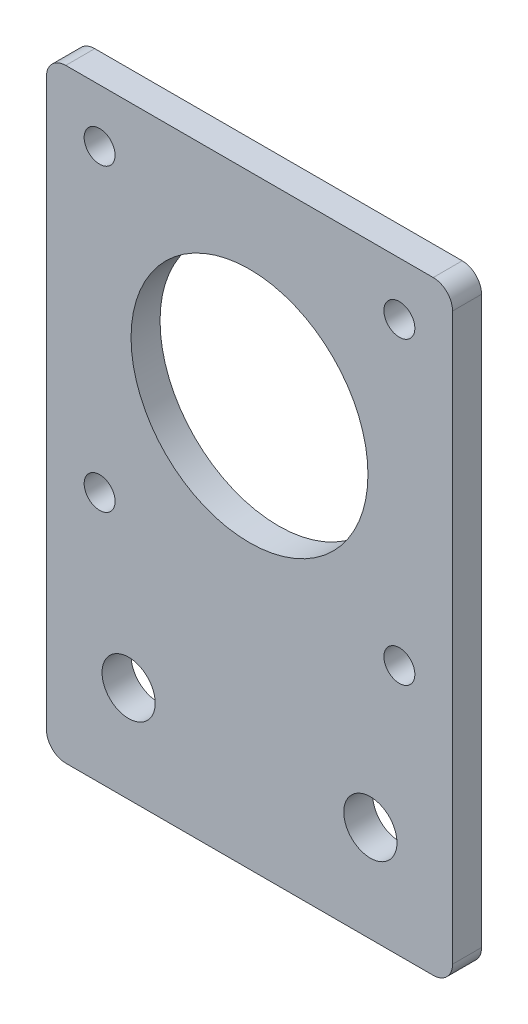
ISO-10303-21;
HEADER;
FILE_DESCRIPTION(('STEP AP214'),'2;1');
FILE_NAME('part.step','',(''),(''),'','','');
FILE_SCHEMA(('AUTOMOTIVE_DESIGN { 1 0 10303 214 1 1 1 1 }'));
ENDSEC;
DATA;
#1=APPLICATION_CONTEXT('core data for automotive mechanical design processes');
#2=APPLICATION_PROTOCOL_DEFINITION('international standard','automotive_design',2000,#1);
#3=PRODUCT_CONTEXT('',#1,'mechanical');
#4=PRODUCT('Part','Part','',(#3));
#5=PRODUCT_RELATED_PRODUCT_CATEGORY('part','',(#4));
#6=PRODUCT_DEFINITION_FORMATION('','',#4);
#7=PRODUCT_DEFINITION_CONTEXT('part definition',#1,'design');
#8=PRODUCT_DEFINITION('design','',#6,#7);
#9=PRODUCT_DEFINITION_SHAPE('','',#8);
#10=(LENGTH_UNIT() NAMED_UNIT(*) SI_UNIT(.MILLI.,.METRE.));
#11=(NAMED_UNIT(*) PLANE_ANGLE_UNIT() SI_UNIT($,.RADIAN.));
#12=(NAMED_UNIT(*) SI_UNIT($,.STERADIAN.) SOLID_ANGLE_UNIT());
#13=UNCERTAINTY_MEASURE_WITH_UNIT(LENGTH_MEASURE(1.E-05),#10,'distance_accuracy_value','');
#14=(GEOMETRIC_REPRESENTATION_CONTEXT(3) GLOBAL_UNCERTAINTY_ASSIGNED_CONTEXT((#13)) GLOBAL_UNIT_ASSIGNED_CONTEXT((#10,
#11,#12)) REPRESENTATION_CONTEXT('',''));
#15=CARTESIAN_POINT('',(0.,0.,0.));
#16=DIRECTION('',(0.,0.,1.));
#17=DIRECTION('',(1.,0.,0.));
#18=AXIS2_PLACEMENT_3D('',#15,#16,#17);
#19=CARTESIAN_POINT('',(0.,0.,1.5));
#20=DIRECTION('',(0.,0.,1.));
#21=DIRECTION('',(1.,0.,0.));
#22=AXIS2_PLACEMENT_3D('',#19,#20,#21);
#23=PLANE('',#22);
#24=CARTESIAN_POINT('',(-12.5,-31.5,1.5));
#25=DIRECTION('',(0.,0.,1.));
#26=DIRECTION('',(1.,0.,0.));
#27=AXIS2_PLACEMENT_3D('',#24,#25,#26);
#28=CIRCLE('',#27,2.75);
#29=CARTESIAN_POINT('',(-9.75,-31.5,1.5));
#30=VERTEX_POINT('',#29);
#31=EDGE_CURVE('E184',#30,#30,#28,.T.);
#32=ORIENTED_EDGE('',*,*,#31,.F.);
#33=EDGE_LOOP('',(#32));
#34=FACE_BOUND('',#33,.T.);
#35=CARTESIAN_POINT('',(-15.5,15.5,1.5));
#36=DIRECTION('',(0.,0.,1.));
#37=DIRECTION('',(1.,0.,0.));
#38=AXIS2_PLACEMENT_3D('',#35,#36,#37);
#39=CIRCLE('',#38,1.6);
#40=CARTESIAN_POINT('',(-13.9,15.5,1.5));
#41=VERTEX_POINT('',#40);
#42=EDGE_CURVE('E196',#41,#41,#39,.T.);
#43=ORIENTED_EDGE('',*,*,#42,.F.);
#44=EDGE_LOOP('',(#43));
#45=FACE_BOUND('',#44,.T.);
#46=CARTESIAN_POINT('',(15.5,-15.5,1.5));
#47=DIRECTION('',(0.,0.,1.));
#48=DIRECTION('',(1.,0.,0.));
#49=AXIS2_PLACEMENT_3D('',#46,#47,#48);
#50=CIRCLE('',#49,1.6);
#51=CARTESIAN_POINT('',(17.1,-15.5,1.5));
#52=VERTEX_POINT('',#51);
#53=EDGE_CURVE('E206',#52,#52,#50,.T.);
#54=ORIENTED_EDGE('',*,*,#53,.F.);
#55=EDGE_LOOP('',(#54));
#56=FACE_BOUND('',#55,.T.);
#57=DIRECTION('',(0.,-1.,0.));
#58=VECTOR('',#57,1.);
#59=CARTESIAN_POINT('',(-21.,21.,1.5));
#60=LINE('',#59,#58);
#61=CARTESIAN_POINT('',(-21.,19.,1.5));
#62=VERTEX_POINT('',#61);
#63=CARTESIAN_POINT('',(-21.,-39.5,1.5));
#64=VERTEX_POINT('',#63);
#65=EDGE_CURVE('E120',#62,#64,#60,.T.);
#66=ORIENTED_EDGE('',*,*,#65,.T.);
#67=CARTESIAN_POINT('',(-19.,-39.5,1.5));
#68=DIRECTION('',(0.,0.,1.));
#69=DIRECTION('',(1.,0.,0.));
#70=AXIS2_PLACEMENT_3D('',#67,#68,#69);
#71=CIRCLE('',#70,2.);
#72=CARTESIAN_POINT('',(-19.,-41.5,1.5));
#73=VERTEX_POINT('',#72);
#74=EDGE_CURVE('E135',#64,#73,#71,.T.);
#75=ORIENTED_EDGE('',*,*,#74,.T.);
#76=DIRECTION('',(1.,0.,0.));
#77=VECTOR('',#76,1.);
#78=CARTESIAN_POINT('',(-21.,-41.5,1.5));
#79=LINE('',#78,#77);
#80=CARTESIAN_POINT('',(19.,-41.5,1.5));
#81=VERTEX_POINT('',#80);
#82=EDGE_CURVE('E102',#73,#81,#79,.T.);
#83=ORIENTED_EDGE('',*,*,#82,.T.);
#84=CARTESIAN_POINT('',(19.,-39.5,1.5));
#85=DIRECTION('',(0.,0.,1.));
#86=DIRECTION('',(1.,0.,0.));
#87=AXIS2_PLACEMENT_3D('',#84,#85,#86);
#88=CIRCLE('',#87,2.);
#89=CARTESIAN_POINT('',(21.,-39.5,1.5));
#90=VERTEX_POINT('',#89);
#91=EDGE_CURVE('E133',#81,#90,#88,.T.);
#92=ORIENTED_EDGE('',*,*,#91,.T.);
#93=DIRECTION('',(0.,1.,0.));
#94=VECTOR('',#93,1.);
#95=CARTESIAN_POINT('',(21.,21.,1.5));
#96=LINE('',#95,#94);
#97=CARTESIAN_POINT('',(21.,19.,1.5));
#98=VERTEX_POINT('',#97);
#99=EDGE_CURVE('E155',#90,#98,#96,.T.);
#100=ORIENTED_EDGE('',*,*,#99,.T.);
#101=CARTESIAN_POINT('',(19.,19.,1.5));
#102=DIRECTION('',(0.,0.,1.));
#103=DIRECTION('',(1.,0.,0.));
#104=AXIS2_PLACEMENT_3D('',#101,#102,#103);
#105=CIRCLE('',#104,2.);
#106=CARTESIAN_POINT('',(19.,21.,1.5));
#107=VERTEX_POINT('',#106);
#108=EDGE_CURVE('E37',#98,#107,#105,.T.);
#109=ORIENTED_EDGE('',*,*,#108,.T.);
#110=DIRECTION('',(-1.,0.,0.));
#111=VECTOR('',#110,1.);
#112=CARTESIAN_POINT('',(-21.,21.,1.5));
#113=LINE('',#112,#111);
#114=CARTESIAN_POINT('',(-19.,21.,1.5));
#115=VERTEX_POINT('',#114);
#116=EDGE_CURVE('E121',#107,#115,#113,.T.);
#117=ORIENTED_EDGE('',*,*,#116,.T.);
#118=CARTESIAN_POINT('',(-19.,19.,1.5));
#119=DIRECTION('',(0.,0.,1.));
#120=DIRECTION('',(1.,0.,0.));
#121=AXIS2_PLACEMENT_3D('',#118,#119,#120);
#122=CIRCLE('',#121,2.);
#123=EDGE_CURVE('E131',#115,#62,#122,.T.);
#124=ORIENTED_EDGE('',*,*,#123,.T.);
#125=EDGE_LOOP('',(#66,#75,#83,#92,#100,#109,#117,#124));
#126=FACE_BOUND('',#125,.T.);
#127=CARTESIAN_POINT('',(0.,0.,1.5));
#128=DIRECTION('',(0.,0.,1.));
#129=DIRECTION('',(1.,0.,0.));
#130=AXIS2_PLACEMENT_3D('',#127,#128,#129);
#131=CIRCLE('',#130,12.25);
#132=CARTESIAN_POINT('',(12.25,0.,1.5));
#133=VERTEX_POINT('',#132);
#134=EDGE_CURVE('E115',#133,#133,#131,.T.);
#135=ORIENTED_EDGE('',*,*,#134,.F.);
#136=EDGE_LOOP('',(#135));
#137=FACE_BOUND('',#136,.T.);
#138=CARTESIAN_POINT('',(-15.5,-15.5,1.5));
#139=DIRECTION('',(0.,0.,1.));
#140=DIRECTION('',(1.,0.,0.));
#141=AXIS2_PLACEMENT_3D('',#138,#139,#140);
#142=CIRCLE('',#141,1.6);
#143=CARTESIAN_POINT('',(-13.9,-15.5,1.5));
#144=VERTEX_POINT('',#143);
#145=EDGE_CURVE('E171',#144,#144,#142,.T.);
#146=ORIENTED_EDGE('',*,*,#145,.F.);
#147=EDGE_LOOP('',(#146));
#148=FACE_BOUND('',#147,.T.);
#149=CARTESIAN_POINT('',(15.5,15.5,1.5));
#150=DIRECTION('',(0.,0.,1.));
#151=DIRECTION('',(1.,0.,0.));
#152=AXIS2_PLACEMENT_3D('',#149,#150,#151);
#153=CIRCLE('',#152,1.6);
#154=CARTESIAN_POINT('',(17.1,15.5,1.5));
#155=VERTEX_POINT('',#154);
#156=EDGE_CURVE('E175',#155,#155,#153,.T.);
#157=ORIENTED_EDGE('',*,*,#156,.F.);
#158=EDGE_LOOP('',(#157));
#159=FACE_BOUND('',#158,.T.);
#160=CARTESIAN_POINT('',(12.5,-31.5,1.5));
#161=DIRECTION('',(0.,0.,1.));
#162=DIRECTION('',(1.,0.,0.));
#163=AXIS2_PLACEMENT_3D('',#160,#161,#162);
#164=CIRCLE('',#163,2.75);
#165=CARTESIAN_POINT('',(15.25,-31.5,1.5));
#166=VERTEX_POINT('',#165);
#167=EDGE_CURVE('E178',#166,#166,#164,.T.);
#168=ORIENTED_EDGE('',*,*,#167,.F.);
#169=EDGE_LOOP('',(#168));
#170=FACE_BOUND('',#169,.T.);
#171=ADVANCED_FACE('F17',(#34,#45,#56,#126,#137,#148,#159,#170),#23,.T.);
#172=CARTESIAN_POINT('',(0.,0.,-1.5));
#173=DIRECTION('',(0.,0.,1.));
#174=DIRECTION('',(1.,0.,0.));
#175=AXIS2_PLACEMENT_3D('',#172,#173,#174);
#176=PLANE('',#175);
#177=DIRECTION('',(1.,0.,0.));
#178=VECTOR('',#177,1.);
#179=CARTESIAN_POINT('',(-21.,-41.5,-1.5));
#180=LINE('',#179,#178);
#181=CARTESIAN_POINT('',(-19.,-41.5,-1.5));
#182=VERTEX_POINT('',#181);
#183=CARTESIAN_POINT('',(19.,-41.5,-1.5));
#184=VERTEX_POINT('',#183);
#185=EDGE_CURVE('E99',#182,#184,#180,.T.);
#186=ORIENTED_EDGE('',*,*,#185,.F.);
#187=CARTESIAN_POINT('',(-19.,-39.5,-1.5));
#188=DIRECTION('',(0.,0.,1.));
#189=DIRECTION('',(1.,0.,0.));
#190=AXIS2_PLACEMENT_3D('',#187,#188,#189);
#191=CIRCLE('',#190,2.);
#192=CARTESIAN_POINT('',(-21.,-39.5,-1.5));
#193=VERTEX_POINT('',#192);
#194=EDGE_CURVE('E82',#182,#193,#191,.F.);
#195=ORIENTED_EDGE('',*,*,#194,.T.);
#196=DIRECTION('',(0.,-1.,0.));
#197=VECTOR('',#196,1.);
#198=CARTESIAN_POINT('',(-21.,21.,-1.5));
#199=LINE('',#198,#197);
#200=CARTESIAN_POINT('',(-21.,19.,-1.5));
#201=VERTEX_POINT('',#200);
#202=EDGE_CURVE('E110',#201,#193,#199,.T.);
#203=ORIENTED_EDGE('',*,*,#202,.F.);
#204=CARTESIAN_POINT('',(-19.,19.,-1.5));
#205=DIRECTION('',(0.,0.,1.));
#206=DIRECTION('',(1.,0.,0.));
#207=AXIS2_PLACEMENT_3D('',#204,#205,#206);
#208=CIRCLE('',#207,2.);
#209=CARTESIAN_POINT('',(-19.,21.,-1.5));
#210=VERTEX_POINT('',#209);
#211=EDGE_CURVE('E124',#201,#210,#208,.F.);
#212=ORIENTED_EDGE('',*,*,#211,.T.);
#213=DIRECTION('',(-1.,0.,0.));
#214=VECTOR('',#213,1.);
#215=CARTESIAN_POINT('',(-21.,21.,-1.5));
#216=LINE('',#215,#214);
#217=CARTESIAN_POINT('',(19.,21.,-1.5));
#218=VERTEX_POINT('',#217);
#219=EDGE_CURVE('E113',#218,#210,#216,.T.);
#220=ORIENTED_EDGE('',*,*,#219,.F.);
#221=CARTESIAN_POINT('',(19.,19.,-1.5));
#222=DIRECTION('',(0.,0.,1.));
#223=DIRECTION('',(1.,0.,0.));
#224=AXIS2_PLACEMENT_3D('',#221,#222,#223);
#225=CIRCLE('',#224,2.);
#226=CARTESIAN_POINT('',(21.,19.,-1.5));
#227=VERTEX_POINT('',#226);
#228=EDGE_CURVE('E103',#218,#227,#225,.F.);
#229=ORIENTED_EDGE('',*,*,#228,.T.);
#230=DIRECTION('',(0.,1.,0.));
#231=VECTOR('',#230,1.);
#232=CARTESIAN_POINT('',(21.,21.,-1.5));
#233=LINE('',#232,#231);
#234=CARTESIAN_POINT('',(21.,-39.5,-1.5));
#235=VERTEX_POINT('',#234);
#236=EDGE_CURVE('E109',#235,#227,#233,.T.);
#237=ORIENTED_EDGE('',*,*,#236,.F.);
#238=CARTESIAN_POINT('',(19.,-39.5,-1.5));
#239=DIRECTION('',(0.,0.,1.));
#240=DIRECTION('',(1.,0.,0.));
#241=AXIS2_PLACEMENT_3D('',#238,#239,#240);
#242=CIRCLE('',#241,2.);
#243=EDGE_CURVE('E93',#235,#184,#242,.F.);
#244=ORIENTED_EDGE('',*,*,#243,.T.);
#245=EDGE_LOOP('',(#186,#195,#203,#212,#220,#229,#237,#244));
#246=FACE_BOUND('',#245,.T.);
#247=CARTESIAN_POINT('',(0.,0.,-1.5));
#248=DIRECTION('',(0.,0.,1.));
#249=DIRECTION('',(1.,0.,0.));
#250=AXIS2_PLACEMENT_3D('',#247,#248,#249);
#251=CIRCLE('',#250,12.25);
#252=CARTESIAN_POINT('',(12.25,0.,-1.5));
#253=VERTEX_POINT('',#252);
#254=EDGE_CURVE('E158',#253,#253,#251,.T.);
#255=ORIENTED_EDGE('',*,*,#254,.T.);
#256=EDGE_LOOP('',(#255));
#257=FACE_BOUND('',#256,.T.);
#258=CARTESIAN_POINT('',(15.5,-15.5,-1.5));
#259=DIRECTION('',(0.,0.,1.));
#260=DIRECTION('',(1.,0.,0.));
#261=AXIS2_PLACEMENT_3D('',#258,#259,#260);
#262=CIRCLE('',#261,1.6);
#263=CARTESIAN_POINT('',(17.1,-15.5,-1.5));
#264=VERTEX_POINT('',#263);
#265=EDGE_CURVE('E203',#264,#264,#262,.T.);
#266=ORIENTED_EDGE('',*,*,#265,.T.);
#267=EDGE_LOOP('',(#266));
#268=FACE_BOUND('',#267,.T.);
#269=CARTESIAN_POINT('',(-15.5,-15.5,-1.5));
#270=DIRECTION('',(0.,0.,1.));
#271=DIRECTION('',(1.,0.,0.));
#272=AXIS2_PLACEMENT_3D('',#269,#270,#271);
#273=CIRCLE('',#272,1.6);
#274=CARTESIAN_POINT('',(-13.9,-15.5,-1.5));
#275=VERTEX_POINT('',#274);
#276=EDGE_CURVE('E199',#275,#275,#273,.T.);
#277=ORIENTED_EDGE('',*,*,#276,.T.);
#278=EDGE_LOOP('',(#277));
#279=FACE_BOUND('',#278,.T.);
#280=CARTESIAN_POINT('',(-15.5,15.5,-1.5));
#281=DIRECTION('',(0.,0.,1.));
#282=DIRECTION('',(1.,0.,0.));
#283=AXIS2_PLACEMENT_3D('',#280,#281,#282);
#284=CIRCLE('',#283,1.6);
#285=CARTESIAN_POINT('',(-13.9,15.5,-1.5));
#286=VERTEX_POINT('',#285);
#287=EDGE_CURVE('E193',#286,#286,#284,.T.);
#288=ORIENTED_EDGE('',*,*,#287,.T.);
#289=EDGE_LOOP('',(#288));
#290=FACE_BOUND('',#289,.T.);
#291=CARTESIAN_POINT('',(15.5,15.5,-1.5));
#292=DIRECTION('',(0.,0.,1.));
#293=DIRECTION('',(1.,0.,0.));
#294=AXIS2_PLACEMENT_3D('',#291,#292,#293);
#295=CIRCLE('',#294,1.6);
#296=CARTESIAN_POINT('',(17.1,15.5,-1.5));
#297=VERTEX_POINT('',#296);
#298=EDGE_CURVE('E190',#297,#297,#295,.T.);
#299=ORIENTED_EDGE('',*,*,#298,.T.);
#300=EDGE_LOOP('',(#299));
#301=FACE_BOUND('',#300,.T.);
#302=CARTESIAN_POINT('',(-12.5,-31.5,-1.5));
#303=DIRECTION('',(0.,0.,1.));
#304=DIRECTION('',(1.,0.,0.));
#305=AXIS2_PLACEMENT_3D('',#302,#303,#304);
#306=CIRCLE('',#305,2.75);
#307=CARTESIAN_POINT('',(-9.75,-31.5,-1.5));
#308=VERTEX_POINT('',#307);
#309=EDGE_CURVE('E180',#308,#308,#306,.T.);
#310=ORIENTED_EDGE('',*,*,#309,.T.);
#311=EDGE_LOOP('',(#310));
#312=FACE_BOUND('',#311,.T.);
#313=CARTESIAN_POINT('',(12.5,-31.5,-1.5));
#314=DIRECTION('',(0.,0.,1.));
#315=DIRECTION('',(1.,0.,0.));
#316=AXIS2_PLACEMENT_3D('',#313,#314,#315);
#317=CIRCLE('',#316,2.75);
#318=CARTESIAN_POINT('',(15.25,-31.5,-1.5));
#319=VERTEX_POINT('',#318);
#320=EDGE_CURVE('E181',#319,#319,#317,.T.);
#321=ORIENTED_EDGE('',*,*,#320,.T.);
#322=EDGE_LOOP('',(#321));
#323=FACE_BOUND('',#322,.T.);
#324=ADVANCED_FACE('F106',(#246,#257,#268,#279,#290,#301,#312,#323),#176,.F.);
#325=CARTESIAN_POINT('',(-21.,21.,1.5));
#326=DIRECTION('',(1.,0.,0.));
#327=DIRECTION('',(0.,1.,0.));
#328=AXIS2_PLACEMENT_3D('',#325,#326,#327);
#329=PLANE('',#328);
#330=ORIENTED_EDGE('',*,*,#202,.T.);
#331=DIRECTION('',(0.,0.,-1.));
#332=VECTOR('',#331,1.);
#333=CARTESIAN_POINT('',(-21.,-39.5,1.5));
#334=LINE('',#333,#332);
#335=EDGE_CURVE('E87',#193,#64,#334,.F.);
#336=ORIENTED_EDGE('',*,*,#335,.T.);
#337=ORIENTED_EDGE('',*,*,#65,.F.);
#338=DIRECTION('',(0.,0.,-1.));
#339=VECTOR('',#338,1.);
#340=CARTESIAN_POINT('',(-21.,19.,1.5));
#341=LINE('',#340,#339);
#342=EDGE_CURVE('E92',#62,#201,#341,.T.);
#343=ORIENTED_EDGE('',*,*,#342,.T.);
#344=EDGE_LOOP('',(#330,#336,#337,#343));
#345=FACE_BOUND('',#344,.T.);
#346=ADVANCED_FACE('F152',(#345),#329,.F.);
#347=CARTESIAN_POINT('',(-21.,-41.5,1.5));
#348=DIRECTION('',(0.,1.,0.));
#349=DIRECTION('',(0.,0.,1.));
#350=AXIS2_PLACEMENT_3D('',#347,#348,#349);
#351=PLANE('',#350);
#352=ORIENTED_EDGE('',*,*,#82,.F.);
#353=DIRECTION('',(0.,0.,-1.));
#354=VECTOR('',#353,1.);
#355=CARTESIAN_POINT('',(-19.,-41.5,1.5));
#356=LINE('',#355,#354);
#357=EDGE_CURVE('E86',#73,#182,#356,.T.);
#358=ORIENTED_EDGE('',*,*,#357,.T.);
#359=ORIENTED_EDGE('',*,*,#185,.T.);
#360=DIRECTION('',(0.,0.,-1.));
#361=VECTOR('',#360,1.);
#362=CARTESIAN_POINT('',(19.,-41.5,1.5));
#363=LINE('',#362,#361);
#364=EDGE_CURVE('E104',#184,#81,#363,.F.);
#365=ORIENTED_EDGE('',*,*,#364,.T.);
#366=EDGE_LOOP('',(#352,#358,#359,#365));
#367=FACE_BOUND('',#366,.T.);
#368=ADVANCED_FACE('F98',(#367),#351,.F.);
#369=CARTESIAN_POINT('',(21.,21.,1.5));
#370=DIRECTION('',(-1.,0.,0.));
#371=DIRECTION('',(0.,-1.,0.));
#372=AXIS2_PLACEMENT_3D('',#369,#370,#371);
#373=PLANE('',#372);
#374=ORIENTED_EDGE('',*,*,#99,.F.);
#375=DIRECTION('',(0.,0.,-1.));
#376=VECTOR('',#375,1.);
#377=CARTESIAN_POINT('',(21.,-39.5,1.5));
#378=LINE('',#377,#376);
#379=EDGE_CURVE('E139',#90,#235,#378,.T.);
#380=ORIENTED_EDGE('',*,*,#379,.T.);
#381=ORIENTED_EDGE('',*,*,#236,.T.);
#382=DIRECTION('',(0.,0.,-1.));
#383=VECTOR('',#382,1.);
#384=CARTESIAN_POINT('',(21.,19.,1.5));
#385=LINE('',#384,#383);
#386=EDGE_CURVE('E137',#227,#98,#385,.F.);
#387=ORIENTED_EDGE('',*,*,#386,.T.);
#388=EDGE_LOOP('',(#374,#380,#381,#387));
#389=FACE_BOUND('',#388,.T.);
#390=ADVANCED_FACE('F228',(#389),#373,.F.);
#391=CARTESIAN_POINT('',(-21.,21.,1.5));
#392=DIRECTION('',(0.,-1.,0.));
#393=DIRECTION('',(0.,0.,-1.));
#394=AXIS2_PLACEMENT_3D('',#391,#392,#393);
#395=PLANE('',#394);
#396=ORIENTED_EDGE('',*,*,#219,.T.);
#397=DIRECTION('',(0.,0.,-1.));
#398=VECTOR('',#397,1.);
#399=CARTESIAN_POINT('',(-19.,21.,1.5));
#400=LINE('',#399,#398);
#401=EDGE_CURVE('E11',#210,#115,#400,.F.);
#402=ORIENTED_EDGE('',*,*,#401,.T.);
#403=ORIENTED_EDGE('',*,*,#116,.F.);
#404=DIRECTION('',(0.,0.,-1.));
#405=VECTOR('',#404,1.);
#406=CARTESIAN_POINT('',(19.,21.,1.5));
#407=LINE('',#406,#405);
#408=EDGE_CURVE('E25',#107,#218,#407,.T.);
#409=ORIENTED_EDGE('',*,*,#408,.T.);
#410=EDGE_LOOP('',(#396,#402,#403,#409));
#411=FACE_BOUND('',#410,.T.);
#412=ADVANCED_FACE('F144',(#411),#395,.F.);
#413=CARTESIAN_POINT('',(0.,0.,1.5));
#414=DIRECTION('',(0.,0.,-1.));
#415=DIRECTION('',(-1.,0.,0.));
#416=AXIS2_PLACEMENT_3D('',#413,#414,#415);
#417=CYLINDRICAL_SURFACE('',#416,12.25);
#418=ORIENTED_EDGE('',*,*,#134,.T.);
#419=EDGE_LOOP('',(#418));
#420=FACE_BOUND('',#419,.T.);
#421=ORIENTED_EDGE('',*,*,#254,.F.);
#422=EDGE_LOOP('',(#421));
#423=FACE_BOUND('',#422,.T.);
#424=ADVANCED_FACE('F215',(#420,#423),#417,.F.);
#425=CARTESIAN_POINT('',(15.5,-15.5,1.5));
#426=DIRECTION('',(0.,0.,-1.));
#427=DIRECTION('',(-1.,0.,0.));
#428=AXIS2_PLACEMENT_3D('',#425,#426,#427);
#429=CYLINDRICAL_SURFACE('',#428,1.6);
#430=ORIENTED_EDGE('',*,*,#53,.T.);
#431=EDGE_LOOP('',(#430));
#432=FACE_BOUND('',#431,.T.);
#433=ORIENTED_EDGE('',*,*,#265,.F.);
#434=EDGE_LOOP('',(#433));
#435=FACE_BOUND('',#434,.T.);
#436=ADVANCED_FACE('F217',(#432,#435),#429,.F.);
#437=CARTESIAN_POINT('',(-15.5,-15.5,1.5));
#438=DIRECTION('',(0.,0.,-1.));
#439=DIRECTION('',(-1.,0.,0.));
#440=AXIS2_PLACEMENT_3D('',#437,#438,#439);
#441=CYLINDRICAL_SURFACE('',#440,1.6);
#442=ORIENTED_EDGE('',*,*,#145,.T.);
#443=EDGE_LOOP('',(#442));
#444=FACE_BOUND('',#443,.T.);
#445=ORIENTED_EDGE('',*,*,#276,.F.);
#446=EDGE_LOOP('',(#445));
#447=FACE_BOUND('',#446,.T.);
#448=ADVANCED_FACE('F225',(#444,#447),#441,.F.);
#449=CARTESIAN_POINT('',(-15.5,15.5,1.5));
#450=DIRECTION('',(0.,0.,-1.));
#451=DIRECTION('',(-1.,0.,0.));
#452=AXIS2_PLACEMENT_3D('',#449,#450,#451);
#453=CYLINDRICAL_SURFACE('',#452,1.6);
#454=ORIENTED_EDGE('',*,*,#42,.T.);
#455=EDGE_LOOP('',(#454));
#456=FACE_BOUND('',#455,.T.);
#457=ORIENTED_EDGE('',*,*,#287,.F.);
#458=EDGE_LOOP('',(#457));
#459=FACE_BOUND('',#458,.T.);
#460=ADVANCED_FACE('F307',(#456,#459),#453,.F.);
#461=CARTESIAN_POINT('',(15.5,15.5,1.5));
#462=DIRECTION('',(0.,0.,-1.));
#463=DIRECTION('',(-1.,0.,0.));
#464=AXIS2_PLACEMENT_3D('',#461,#462,#463);
#465=CYLINDRICAL_SURFACE('',#464,1.6);
#466=ORIENTED_EDGE('',*,*,#156,.T.);
#467=EDGE_LOOP('',(#466));
#468=FACE_BOUND('',#467,.T.);
#469=ORIENTED_EDGE('',*,*,#298,.F.);
#470=EDGE_LOOP('',(#469));
#471=FACE_BOUND('',#470,.T.);
#472=ADVANCED_FACE('F297',(#468,#471),#465,.F.);
#473=CARTESIAN_POINT('',(-12.5,-31.5,1.5));
#474=DIRECTION('',(0.,0.,-1.));
#475=DIRECTION('',(-1.,0.,0.));
#476=AXIS2_PLACEMENT_3D('',#473,#474,#475);
#477=CYLINDRICAL_SURFACE('',#476,2.75);
#478=ORIENTED_EDGE('',*,*,#31,.T.);
#479=EDGE_LOOP('',(#478));
#480=FACE_BOUND('',#479,.T.);
#481=ORIENTED_EDGE('',*,*,#309,.F.);
#482=EDGE_LOOP('',(#481));
#483=FACE_BOUND('',#482,.T.);
#484=ADVANCED_FACE('F288',(#480,#483),#477,.F.);
#485=CARTESIAN_POINT('',(12.5,-31.5,1.5));
#486=DIRECTION('',(0.,0.,-1.));
#487=DIRECTION('',(-1.,0.,0.));
#488=AXIS2_PLACEMENT_3D('',#485,#486,#487);
#489=CYLINDRICAL_SURFACE('',#488,2.75);
#490=ORIENTED_EDGE('',*,*,#167,.T.);
#491=EDGE_LOOP('',(#490));
#492=FACE_BOUND('',#491,.T.);
#493=ORIENTED_EDGE('',*,*,#320,.F.);
#494=EDGE_LOOP('',(#493));
#495=FACE_BOUND('',#494,.T.);
#496=ADVANCED_FACE('F244',(#492,#495),#489,.F.);
#497=CARTESIAN_POINT('',(-19.,-39.5,1.5));
#498=DIRECTION('',(0.,0.,-1.));
#499=DIRECTION('',(-1.,0.,0.));
#500=AXIS2_PLACEMENT_3D('',#497,#498,#499);
#501=CYLINDRICAL_SURFACE('',#500,2.);
#502=ORIENTED_EDGE('',*,*,#74,.F.);
#503=ORIENTED_EDGE('',*,*,#335,.F.);
#504=ORIENTED_EDGE('',*,*,#194,.F.);
#505=ORIENTED_EDGE('',*,*,#357,.F.);
#506=EDGE_LOOP('',(#502,#503,#504,#505));
#507=FACE_BOUND('',#506,.T.);
#508=ADVANCED_FACE('F85',(#507),#501,.T.);
#509=CARTESIAN_POINT('',(19.,-39.5,1.5));
#510=DIRECTION('',(0.,0.,-1.));
#511=DIRECTION('',(-1.,0.,0.));
#512=AXIS2_PLACEMENT_3D('',#509,#510,#511);
#513=CYLINDRICAL_SURFACE('',#512,2.);
#514=ORIENTED_EDGE('',*,*,#91,.F.);
#515=ORIENTED_EDGE('',*,*,#364,.F.);
#516=ORIENTED_EDGE('',*,*,#243,.F.);
#517=ORIENTED_EDGE('',*,*,#379,.F.);
#518=EDGE_LOOP('',(#514,#515,#516,#517));
#519=FACE_BOUND('',#518,.T.);
#520=ADVANCED_FACE('F243',(#519),#513,.T.);
#521=CARTESIAN_POINT('',(-19.,19.,1.5));
#522=DIRECTION('',(0.,0.,-1.));
#523=DIRECTION('',(-1.,0.,0.));
#524=AXIS2_PLACEMENT_3D('',#521,#522,#523);
#525=CYLINDRICAL_SURFACE('',#524,2.);
#526=ORIENTED_EDGE('',*,*,#123,.F.);
#527=ORIENTED_EDGE('',*,*,#401,.F.);
#528=ORIENTED_EDGE('',*,*,#211,.F.);
#529=ORIENTED_EDGE('',*,*,#342,.F.);
#530=EDGE_LOOP('',(#526,#527,#528,#529));
#531=FACE_BOUND('',#530,.T.);
#532=ADVANCED_FACE('F149',(#531),#525,.T.);
#533=CARTESIAN_POINT('',(19.,19.,1.5));
#534=DIRECTION('',(0.,0.,-1.));
#535=DIRECTION('',(-1.,0.,0.));
#536=AXIS2_PLACEMENT_3D('',#533,#534,#535);
#537=CYLINDRICAL_SURFACE('',#536,2.);
#538=ORIENTED_EDGE('',*,*,#108,.F.);
#539=ORIENTED_EDGE('',*,*,#386,.F.);
#540=ORIENTED_EDGE('',*,*,#228,.F.);
#541=ORIENTED_EDGE('',*,*,#408,.F.);
#542=EDGE_LOOP('',(#538,#539,#540,#541));
#543=FACE_BOUND('',#542,.T.);
#544=ADVANCED_FACE('F19',(#543),#537,.T.);
#545=CLOSED_SHELL('',(#171,#324,#346,#368,#390,#412,#424,#436,#448,#460,#472,#484,#496,#508,
#520,#532,#544));
#546=MANIFOLD_SOLID_BREP('B1',#545);
#547=ADVANCED_BREP_SHAPE_REPRESENTATION('',(#18,#546),#14);
#548=SHAPE_DEFINITION_REPRESENTATION(#9,#547);
ENDSEC;
END-ISO-10303-21;
